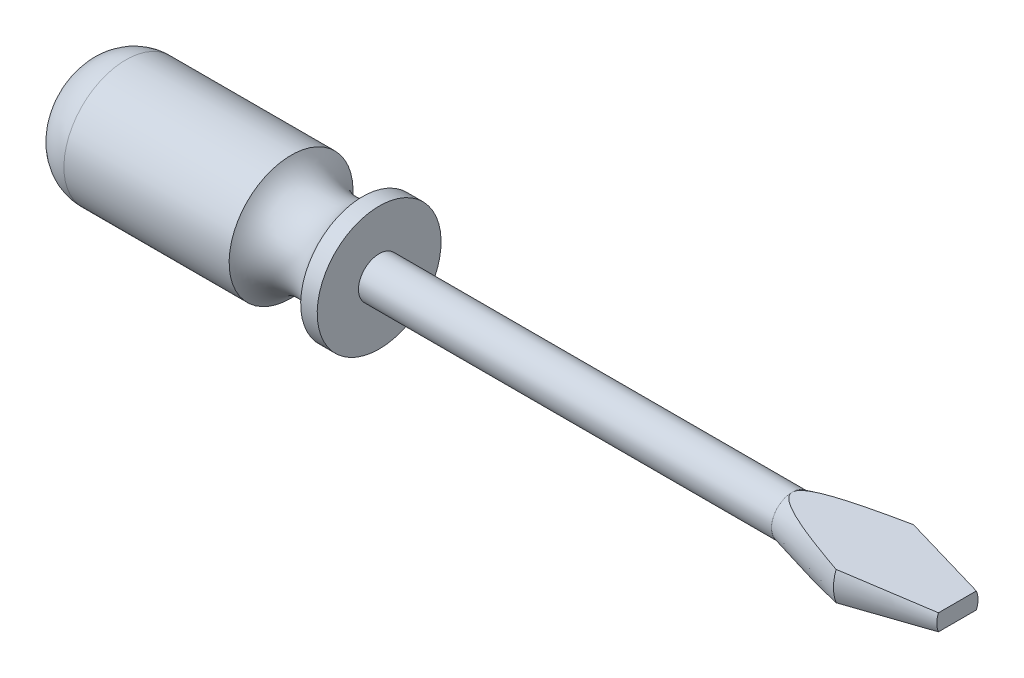
ISO-10303-21;
HEADER;
FILE_DESCRIPTION(('STEP AP214'),'2;1');
FILE_NAME('part.step','',(''),(''),'','','');
FILE_SCHEMA(('AUTOMOTIVE_DESIGN { 1 0 10303 214 1 1 1 1 }'));
ENDSEC;
DATA;
#1=APPLICATION_CONTEXT('core data for automotive mechanical design processes');
#2=APPLICATION_PROTOCOL_DEFINITION('international standard','automotive_design',2000,#1);
#3=PRODUCT_CONTEXT('',#1,'mechanical');
#4=PRODUCT('Part','Part','',(#3));
#5=PRODUCT_RELATED_PRODUCT_CATEGORY('part','',(#4));
#6=PRODUCT_DEFINITION_FORMATION('','',#4);
#7=PRODUCT_DEFINITION_CONTEXT('part definition',#1,'design');
#8=PRODUCT_DEFINITION('design','',#6,#7);
#9=PRODUCT_DEFINITION_SHAPE('','',#8);
#10=(LENGTH_UNIT() NAMED_UNIT(*) SI_UNIT(.MILLI.,.METRE.));
#11=(NAMED_UNIT(*) PLANE_ANGLE_UNIT() SI_UNIT($,.RADIAN.));
#12=(NAMED_UNIT(*) SI_UNIT($,.STERADIAN.) SOLID_ANGLE_UNIT());
#13=UNCERTAINTY_MEASURE_WITH_UNIT(LENGTH_MEASURE(1.E-05),#10,'distance_accuracy_value','');
#14=(GEOMETRIC_REPRESENTATION_CONTEXT(3) GLOBAL_UNCERTAINTY_ASSIGNED_CONTEXT((#13)) GLOBAL_UNIT_ASSIGNED_CONTEXT((#10,
#11,#12)) REPRESENTATION_CONTEXT('',''));
#15=CARTESIAN_POINT('',(0.,0.,0.));
#16=DIRECTION('',(0.,0.,1.));
#17=DIRECTION('',(1.,0.,0.));
#18=AXIS2_PLACEMENT_3D('',#15,#16,#17);
#19=CARTESIAN_POINT('',(262.604902341225,-10.16,0.));
#20=DIRECTION('',(-1.,0.,0.));
#21=DIRECTION('',(0.,-1.,0.));
#22=AXIS2_PLACEMENT_3D('',#19,#20,#21);
#23=CONICAL_SURFACE('',#22,6.34999999999998,0.244978663126864);
#24=CARTESIAN_POINT('',(262.604902341225,-10.16,0.));
#25=DIRECTION('',(-1.,0.,0.));
#26=DIRECTION('',(0.,-1.,0.));
#27=AXIS2_PLACEMENT_3D('',#24,#25,#26);
#28=CIRCLE('',#27,6.34999999999998);
#29=CARTESIAN_POINT('',(262.604902341225,-7.61999999999998,-5.81987113259389));
#30=VERTEX_POINT('',#29);
#31=CARTESIAN_POINT('',(262.604902341225,-12.7,-5.81987113259389));
#32=VERTEX_POINT('',#31);
#33=EDGE_CURVE('E134',#30,#32,#28,.T.);
#34=ORIENTED_EDGE('',*,*,#33,.T.);
#35=CARTESIAN_POINT('',(262.605102341225,-12.699985,-5.81982312465548));
#36=CARTESIAN_POINT('',(260.953041574203,-12.8238895575267,-6.21634585834817));
#37=CARTESIAN_POINT('',(259.300881256028,-12.9478015813898,-6.61245102144552));
#38=CARTESIAN_POINT('',(255.996421578026,-13.1956360572399,-7.40407731520765));
#39=CARTESIAN_POINT('',(254.344122218208,-13.3195585092263,-7.79959844590715));
#40=CARTESIAN_POINT('',(250.110744727801,-13.6370618210068,-8.81251753072126));
#41=CARTESIAN_POINT('',(247.529609589218,-13.8306469564005,-9.42967581288631));
#42=CARTESIAN_POINT('',(242.367223432261,-14.2178259181723,-10.6635058675909));
#43=CARTESIAN_POINT('',(239.785972413875,-14.4114197445512,-11.2801776400872));
#44=CARTESIAN_POINT('',(237.204702341225,-14.605015,-11.8967689585145));
#45=B_SPLINE_CURVE_WITH_KNOTS('',3,(#35,#36,#37,#38,#39,#40,#41,#42,#43,#44),.UNSPECIFIED.,.F.,
.F.,(4,2,2,2,4),(0.,5.11047790606675,10.2209555082263,18.2037847393658,26.1866146780629),.UNSPECIFIED.);
#46=CARTESIAN_POINT('',(237.204902341225,-14.605,-11.8967211869489));
#47=VERTEX_POINT('',#46);
#48=EDGE_CURVE('E169',#32,#47,#45,.T.);
#49=ORIENTED_EDGE('',*,*,#48,.T.);
#50=CARTESIAN_POINT('',(237.204902341225,-10.16,0.));
#51=DIRECTION('',(-1.,0.,0.));
#52=DIRECTION('',(0.,-1.,0.));
#53=AXIS2_PLACEMENT_3D('',#50,#51,#52);
#54=CIRCLE('',#53,12.7);
#55=CARTESIAN_POINT('',(237.204902341225,-5.71499999999999,-11.8967211869489));
#56=VERTEX_POINT('',#55);
#57=EDGE_CURVE('E175',#56,#47,#54,.T.);
#58=ORIENTED_EDGE('',*,*,#57,.F.);
#59=CARTESIAN_POINT('',(237.204702341225,-5.71498499999999,-11.8967689585145));
#60=CARTESIAN_POINT('',(238.857212934661,-5.83892329450762,-11.5020494331461));
#61=CARTESIAN_POINT('',(240.509711628732,-5.96286069656299,-11.1072797827059));
#62=CARTESIAN_POINT('',(243.814670851591,-6.21073263827738,-10.317579580244));
#63=CARTESIAN_POINT('',(245.467131380376,-6.3346671779363,-9.92264902821614));
#64=CARTESIAN_POINT('',(248.771999517479,-6.58253228821903,-9.13256646401271));
#65=CARTESIAN_POINT('',(250.424407125805,-6.70646285884348,-8.73741445187217));
#66=CARTESIAN_POINT('',(253.729143940903,-6.95431811997584,-7.94678094404611));
#67=CARTESIAN_POINT('',(255.381473147677,-7.07824281048384,-7.55129944836611));
#68=CARTESIAN_POINT('',(257.962349986188,-7.27180857337218,-6.93314213404777));
#69=CARTESIAN_POINT('',(258.89094004132,-7.34145282750705,-6.71064445273438));
#70=CARTESIAN_POINT('',(260.748065784407,-7.48073725823858,-6.26542087527748));
#71=CARTESIAN_POINT('',(261.67660147236,-7.55037743483507,-6.04269497912436));
#72=CARTESIAN_POINT('',(262.605102341225,-7.62001499999998,-5.81982312465549));
#73=B_SPLINE_CURVE_WITH_KNOTS('',3,(#59,#60,#61,#62,#63,#64,#65,#66,#67,#68,#69,#70,#71,#72),
.UNSPECIFIED.,.F.,.F.,(4,2,2,2,2,2,4),(0.,5.11053806241534,10.221076321393,15.3316137716052,
20.442151136199,23.3143828701998,26.1866147250381),.UNSPECIFIED.);
#74=EDGE_CURVE('E60',#56,#30,#73,.T.);
#75=ORIENTED_EDGE('',*,*,#74,.T.);
#76=EDGE_LOOP('',(#34,#49,#58,#75));
#77=FACE_BOUND('',#76,.T.);
#78=ADVANCED_FACE('F38',(#77),#23,.T.);
#79=CARTESIAN_POINT('',(237.204902341225,-10.16,0.));
#80=DIRECTION('',(1.,0.,0.));
#81=DIRECTION('',(0.,1.,0.));
#82=AXIS2_PLACEMENT_3D('',#79,#80,#81);
#83=CONICAL_SURFACE('',#82,12.7,0.244978663126864);
#84=ORIENTED_EDGE('',*,*,#57,.T.);
#85=CARTESIAN_POINT('',(237.205102341225,-14.604985,-11.896780167435));
#86=CARTESIAN_POINT('',(236.423148954335,-14.6636315040167,-11.666133264435));
#87=CARTESIAN_POINT('',(235.641791040913,-14.7222333475234,-11.4334322132479));
#88=CARTESIAN_POINT('',(234.080539261981,-14.8393272309433,-10.9629047530639));
#89=CARTESIAN_POINT('',(233.300645528121,-14.8978192609828,-10.7250779051218));
#90=CARTESIAN_POINT('',(231.73977346084,-15.0148846660289,-10.2424069184595));
#91=CARTESIAN_POINT('',(230.958802244536,-15.0734575072517,-9.99753957309691));
#92=CARTESIAN_POINT('',(229.399302809387,-15.1904199648879,-9.50023868483601));
#93=CARTESIAN_POINT('',(228.620774460083,-15.2488095910856,-9.24780555384782));
#94=CARTESIAN_POINT('',(227.002511802881,-15.3701792903758,-8.71216708799808));
#95=CARTESIAN_POINT('',(226.163044870306,-15.4331393103189,-8.42814409154545));
#96=CARTESIAN_POINT('',(224.907588253603,-15.5272985565717,-7.99104744771596));
#97=CARTESIAN_POINT('',(224.489687740695,-15.5586410950397,-7.843490546611));
#98=CARTESIAN_POINT('',(223.655427652557,-15.6212106016501,-7.5440591647481));
#99=CARTESIAN_POINT('',(223.239068066127,-15.6524375706324,-7.39218471544113));
#100=CARTESIAN_POINT('',(222.409020474117,-15.7146911400331,-7.08363726494979));
#101=CARTESIAN_POINT('',(221.995328886915,-15.7457180090732,-6.92697397223866));
#102=CARTESIAN_POINT('',(221.170286560956,-15.8075961835202,-6.60757105286901));
#103=CARTESIAN_POINT('',(220.758935777071,-15.8384474923116,-6.44483154381463));
#104=CARTESIAN_POINT('',(219.939341055086,-15.8999170964604,-6.11198894514595));
#105=CARTESIAN_POINT('',(219.531096234769,-15.9305354579842,-5.94188804584711));
#106=CARTESIAN_POINT('',(218.718555396105,-15.991476020884,-5.59248136564047));
#107=CARTESIAN_POINT('',(218.314259018587,-16.0217982491979,-5.41317643144125));
#108=CARTESIAN_POINT('',(217.717597458846,-16.0665478661784,-5.13798472724237));
#109=CARTESIAN_POINT('',(217.523158407819,-16.0811307950054,-5.04661509816555));
#110=CARTESIAN_POINT('',(217.135800996474,-16.1101826008563,-4.86066957075078));
#111=CARTESIAN_POINT('',(216.94288267272,-16.1246514751378,-4.76609359561003));
#112=CARTESIAN_POINT('',(216.558677528833,-16.1534668609294,-4.57315049147633));
#113=CARTESIAN_POINT('',(216.367392679653,-16.1678132246179,-4.47477940655367));
#114=CARTESIAN_POINT('',(215.987086951308,-16.1963361542438,-4.27373391947859));
#115=CARTESIAN_POINT('',(215.798065987508,-16.2105127265287,-4.17105967884532));
#116=CARTESIAN_POINT('',(215.42464642301,-16.2385191938661,-3.96164111978326));
#117=CARTESIAN_POINT('',(215.240220874325,-16.2523511100175,-3.85494529689914));
#118=CARTESIAN_POINT('',(214.874920810834,-16.2797486147793,-3.63561365341306));
#119=CARTESIAN_POINT('',(214.694045950007,-16.2933142293414,-3.52297841559905));
#120=CARTESIAN_POINT('',(214.337214248218,-16.3200766069755,-3.29066932417492));
#121=CARTESIAN_POINT('',(214.161250376139,-16.3332738973814,-3.17100638493364));
#122=CARTESIAN_POINT('',(213.815660631936,-16.3591931281967,-2.9228561781945));
#123=CARTESIAN_POINT('',(213.64603180488,-16.3719152902259,-2.79437310620017));
#124=CARTESIAN_POINT('',(213.385901580478,-16.391425057056,-2.58324162558706));
#125=CARTESIAN_POINT('',(213.292400870262,-16.3984376103222,-2.50431161894544));
#126=CARTESIAN_POINT('',(213.109088364642,-16.4121860482438,-2.34219346010268));
#127=CARTESIAN_POINT('',(213.019277329387,-16.4189218758879,-2.25900443830693));
#128=CARTESIAN_POINT('',(212.844438175806,-16.4320348124064,-2.08782950453245));
#129=CARTESIAN_POINT('',(212.759405908953,-16.4384122324204,-1.99984788797691));
#130=CARTESIAN_POINT('',(212.595464157806,-16.4507078637564,-1.81836027114636));
#131=CARTESIAN_POINT('',(212.516552151159,-16.4566262642549,-1.72485657498288));
#132=CARTESIAN_POINT('',(212.343515555669,-16.4696040089167,-1.50170585466757));
#133=CARTESIAN_POINT('',(212.252210364966,-16.4764518982195,-1.36980901725));
#134=CARTESIAN_POINT('',(212.089348035938,-16.4886665728965,-1.0941475050801));
#135=CARTESIAN_POINT('',(212.017759799522,-16.4940356906278,-0.950401989131232));
#136=CARTESIAN_POINT('',(211.915616459397,-16.5016964411371,-0.686122892290398));
#137=CARTESIAN_POINT('',(211.87941684517,-16.5044114122041,-0.567822731114482));
#138=CARTESIAN_POINT('',(211.827288680122,-16.5083210245827,-0.326856382706482));
#139=CARTESIAN_POINT('',(211.811328353188,-16.5095180491028,-0.204197351081149));
#140=CARTESIAN_POINT('',(211.801645219382,-16.5102442841382,0.0424573223423772));
#141=CARTESIAN_POINT('',(211.807999242697,-16.5097677323896,0.166456113756943));
#142=CARTESIAN_POINT('',(211.8422535813,-16.5071986569943,0.411464838814655));
#143=CARTESIAN_POINT('',(211.870181529483,-16.5051040608807,0.532470733723015));
#144=CARTESIAN_POINT('',(211.955145024342,-16.4987317987662,0.802800188340951));
#145=CARTESIAN_POINT('',(212.018271789895,-16.4939972913498,0.950163308258109));
#146=CARTESIAN_POINT('',(212.16667845997,-16.4828667910941,1.2331005572344));
#147=CARTESIAN_POINT('',(212.252005076631,-16.4764672948446,1.3686490136259));
#148=CARTESIAN_POINT('',(212.430560293883,-16.4630756535507,1.61818866676422));
#149=CARTESIAN_POINT('',(212.522624796809,-16.4561708158312,1.73303696132612));
#150=CARTESIAN_POINT('',(212.716168362139,-16.4416550484315,1.95453996463457));
#151=CARTESIAN_POINT('',(212.817656273818,-16.4340434550555,2.06118679626261));
#152=CARTESIAN_POINT('',(213.027811343477,-16.4182818248311,2.26774720267559));
#153=CARTESIAN_POINT('',(213.136500844983,-16.4101301122181,2.36763767340383));
#154=CARTESIAN_POINT('',(213.358997269276,-16.3934428803962,2.56135921216659));
#155=CARTESIAN_POINT('',(213.472801801935,-16.3849075404467,2.655193061389));
#156=CARTESIAN_POINT('',(213.694572313226,-16.3682747520999,2.8300250718732));
#157=CARTESIAN_POINT('',(213.802215885832,-16.3602014841545,2.91143713233013));
#158=CARTESIAN_POINT('',(214.020192635562,-16.3438532279247,3.07056505842257));
#159=CARTESIAN_POINT('',(214.130526098925,-16.3355782181725,3.14828052807408));
#160=CARTESIAN_POINT('',(214.464907971201,-16.3104995777518,3.3766913687632));
#161=CARTESIAN_POINT('',(214.692230906053,-16.2934503576379,3.52256872453639));
#162=CARTESIAN_POINT('',(215.153365844264,-16.2588652372721,3.80464449381971));
#163=CARTESIAN_POINT('',(215.387190803561,-16.2413283653248,3.94082131992909));
#164=CARTESIAN_POINT('',(215.859298829066,-16.2059202634119,4.205203783907));
#165=CARTESIAN_POINT('',(216.097582445266,-16.1880489921969,4.33340842983334));
#166=CARTESIAN_POINT('',(216.579645695055,-16.1518942484627,4.58442425084875));
#167=CARTESIAN_POINT('',(216.823455406171,-16.133608520129,4.7071770386145));
#168=CARTESIAN_POINT('',(217.313753529073,-16.0968361609114,4.94719837008236));
#169=CARTESIAN_POINT('',(217.560242099497,-16.0783495181296,5.06446658678919));
#170=CARTESIAN_POINT('',(218.054981473709,-16.0412440650637,5.2942076252729));
#171=CARTESIAN_POINT('',(218.303229119173,-16.0226254916539,5.40668730576532));
#172=CARTESIAN_POINT('',(218.801451894903,-15.9852587834741,5.62770467267778));
#173=CARTESIAN_POINT('',(219.051426984618,-15.9665106517455,5.73624245125965));
#174=CARTESIAN_POINT('',(219.675099606255,-15.9197352051228,6.00203813742517));
#175=CARTESIAN_POINT('',(220.049669777516,-15.8916424422782,6.15723629159133));
#176=CARTESIAN_POINT('',(220.801288758477,-15.8352710187061,6.46148943280876));
#177=CARTESIAN_POINT('',(221.178337662001,-15.8069923509418,6.61054418575221));
#178=CARTESIAN_POINT('',(221.934459137276,-15.7502832402962,6.90354313354041));
#179=CARTESIAN_POINT('',(222.313531972565,-15.7218527776495,7.0474866432035));
#180=CARTESIAN_POINT('',(223.073293257692,-15.664870681265,7.33102601838842));
#181=CARTESIAN_POINT('',(223.453981730613,-15.6363190457959,7.47062182155514));
#182=CARTESIAN_POINT('',(224.599062999327,-15.5504379506424,7.88421755719093));
#183=CARTESIAN_POINT('',(225.365460491359,-15.4929581387399,8.15263821740255));
#184=CARTESIAN_POINT('',(226.901992610424,-15.3777182298101,8.67822915369851));
#185=CARTESIAN_POINT('',(227.672126951868,-15.3199581542018,8.93540027493936));
#186=CARTESIAN_POINT('',(229.170850184902,-15.2075539117242,9.42638556616627));
#187=CARTESIAN_POINT('',(229.899279031903,-15.1529217481991,9.66069213774161));
#188=CARTESIAN_POINT('',(231.358154542361,-15.0435060849148,10.1229529842761));
#189=CARTESIAN_POINT('',(232.088601256751,-14.9887225813355,10.3509070972463));
#190=CARTESIAN_POINT('',(233.549328630996,-14.8791680282672,10.8010215769278));
#191=CARTESIAN_POINT('',(234.279605408216,-14.8243972699757,11.0231946388345));
#192=CARTESIAN_POINT('',(235.74144716165,-14.7147591384681,11.4631084132408));
#193=CARTESIAN_POINT('',(236.473012072962,-14.6598917701197,11.6808493424824));
#194=CARTESIAN_POINT('',(237.205102341225,-14.604985,11.896780167435));
#195=B_SPLINE_CURVE_WITH_KNOTS('',3,(#85,#86,#87,#88,#89,#90,#91,#92,#93,#94,#95,#96,#97,#98,
#99,#100,#101,#102,#103,#104,#105,#106,#107,#108,#109,#110,#111,#112,#113,#114,#115,#116,#117,
#118,#119,#120,#121,#122,#123,#124,#125,#126,#127,#128,#129,#130,#131,#132,#133,#134,#135,#136,
#137,#138,#139,#140,#141,#142,#143,#144,#145,#146,#147,#148,#149,#150,#151,#152,#153,#154,#155,
#156,#157,#158,#159,#160,#161,#162,#163,#164,#165,#166,#167,#168,#169,#170,#171,#172,#173,#174,
#175,#176,#177,#178,#179,#180,#181,#182,#183,#184,#185,#186,#187,#188,#189,#190,#191,#192,#193,
#194),.UNSPECIFIED.,.F.,.F.,(4,2,2,2,2,2,2,2,2,2,2,2,2,2,2,2,2,2,2,2,2,2,2,2,2,2,2,2,2,2,2,2,2,
2,2,2,2,2,2,2,2,2,2,2,2,2,2,2,2,2,2,2,2,2,4),(0.,2.45210756189365,4.90442594987017,
7.36605145643176,9.82754318532405,12.4927650821045,13.8256255492284,15.1584763096837,
16.4887840050669,17.8190659659045,19.1489547986512,20.4787215091637,21.1246926501334,
21.7706792752395,22.4173584876576,23.0640134486427,23.7044647675775,24.3448533605901,
24.9842724293535,25.6233894231932,25.990973702221,26.3586333353133,26.7259687036676,
27.0931518680609,27.5736356757967,28.0533572547286,28.4231012079995,28.7922639337393,
29.1626989621424,29.5336092494143,30.012047778047,30.491501278452,30.9329141055299,
31.3747457270137,31.8180189233256,32.2610870997415,32.6666113323136,33.0721789078272,
33.8837192250454,34.6970124913964,35.5104067504823,36.3310646162872,37.151771348277,
37.9712600399993,38.7907295596923,40.0099218881612,41.229160633764,42.4485622106311,
43.6679812681993,46.1100754053703,48.5519857564292,50.8533486986866,53.154770272534,
55.4506178328488,57.746352849555),.UNSPECIFIED.);
#196=CARTESIAN_POINT('',(211.804902341225,-16.51,0.));
#197=VERTEX_POINT('',#196);
#198=EDGE_CURVE('E11',#47,#197,#195,.T.);
#199=ORIENTED_EDGE('',*,*,#198,.T.);
#200=CARTESIAN_POINT('',(211.804902341225,-10.16,0.));
#201=DIRECTION('',(-1.,0.,0.));
#202=DIRECTION('',(0.,-1.,0.));
#203=AXIS2_PLACEMENT_3D('',#200,#201,#202);
#204=CIRCLE('',#203,6.34999999999998);
#205=CARTESIAN_POINT('',(211.804902341225,-3.81,0.));
#206=VERTEX_POINT('',#205);
#207=EDGE_CURVE('E111',#206,#197,#204,.T.);
#208=ORIENTED_EDGE('',*,*,#207,.F.);
#209=CARTESIAN_POINT('',(237.205102341225,-5.71501499999999,11.896780167435));
#210=CARTESIAN_POINT('',(236.423148954335,-5.65636849598325,11.666133264435));
#211=CARTESIAN_POINT('',(235.641791040913,-5.59776665247658,11.4334322132479));
#212=CARTESIAN_POINT('',(234.080539261981,-5.48067276905664,10.9629047530639));
#213=CARTESIAN_POINT('',(233.300645528121,-5.42218073901718,10.7250779051218));
#214=CARTESIAN_POINT('',(231.73977346084,-5.30511533397106,10.2424069184595));
#215=CARTESIAN_POINT('',(230.958802244536,-5.24654249274826,9.9975395730969));
#216=CARTESIAN_POINT('',(229.399302809387,-5.12958003511209,9.500238684836));
#217=CARTESIAN_POINT('',(228.620774460083,-5.07119040891431,9.24780555384781));
#218=CARTESIAN_POINT('',(227.002511802881,-4.94982070962413,8.71216708799806));
#219=CARTESIAN_POINT('',(226.163044870306,-4.88686068968106,8.42814409154543));
#220=CARTESIAN_POINT('',(224.907588253603,-4.7927014434283,7.99104744771594));
#221=CARTESIAN_POINT('',(224.489687740695,-4.76135890496023,7.84349054661098));
#222=CARTESIAN_POINT('',(223.655427652557,-4.69878939834987,7.54405916474808));
#223=CARTESIAN_POINT('',(223.239068066127,-4.6675624293676,7.39218471544111));
#224=CARTESIAN_POINT('',(222.409020474117,-4.60530885996687,7.08363726494977));
#225=CARTESIAN_POINT('',(221.995328886915,-4.57428199092673,6.92697397223864));
#226=CARTESIAN_POINT('',(221.170286560956,-4.5124038164798,6.607571052869));
#227=CARTESIAN_POINT('',(220.758935777071,-4.48155250768838,6.44483154381463));
#228=CARTESIAN_POINT('',(219.939341055086,-4.42008290353953,6.11198894514594));
#229=CARTESIAN_POINT('',(219.531096234769,-4.38946454201577,5.94188804584709));
#230=CARTESIAN_POINT('',(218.718555396105,-4.32852397911599,5.59248136564046));
#231=CARTESIAN_POINT('',(218.314259018587,-4.2982017508021,5.41317643144125));
#232=CARTESIAN_POINT('',(217.717597458846,-4.25345213382157,5.13798472724237));
#233=CARTESIAN_POINT('',(217.523158407819,-4.23886920499451,5.04661509816554));
#234=CARTESIAN_POINT('',(217.135800996474,-4.20981739914367,4.86066957075078));
#235=CARTESIAN_POINT('',(216.94288267272,-4.19534852486212,4.76609359561003));
#236=CARTESIAN_POINT('',(216.558677528833,-4.16653313907055,4.57315049147634));
#237=CARTESIAN_POINT('',(216.367392679653,-4.15218677538209,4.47477940655367));
#238=CARTESIAN_POINT('',(215.987086951308,-4.12366384575617,4.27373391947858));
#239=CARTESIAN_POINT('',(215.798065987508,-4.10948727347122,4.17105967884532));
#240=CARTESIAN_POINT('',(215.42464642301,-4.08148080613382,3.96164111978326));
#241=CARTESIAN_POINT('',(215.240220874325,-4.0676488899825,3.85494529689913));
#242=CARTESIAN_POINT('',(214.874920810834,-4.04025138522063,3.63561365341306));
#243=CARTESIAN_POINT('',(214.694045950007,-4.02668577065859,3.52297841559905));
#244=CARTESIAN_POINT('',(214.337214248218,-3.99992339302444,3.29066932417491));
#245=CARTESIAN_POINT('',(214.161250376139,-3.98672610261854,3.17100638493364));
#246=CARTESIAN_POINT('',(213.815660631936,-3.96080687180329,2.92285617819449));
#247=CARTESIAN_POINT('',(213.64603180488,-3.94808470977407,2.79437310620016));
#248=CARTESIAN_POINT('',(213.385901580478,-3.92857494294391,2.58324162558707));
#249=CARTESIAN_POINT('',(213.292400870262,-3.92156238967773,2.50431161894546));
#250=CARTESIAN_POINT('',(213.109088364642,-3.90781395175621,2.3421934601027));
#251=CARTESIAN_POINT('',(213.019277329387,-3.9010781241121,2.25900443830695));
#252=CARTESIAN_POINT('',(212.844438175806,-3.88796518759355,2.08782950453247));
#253=CARTESIAN_POINT('',(212.759405908953,-3.88158776757956,1.99984788797693));
#254=CARTESIAN_POINT('',(212.595464157806,-3.86929213624351,1.81836027114638));
#255=CARTESIAN_POINT('',(212.516552151159,-3.86337373574504,1.7248565749829));
#256=CARTESIAN_POINT('',(212.343515555669,-3.85039599108325,1.50170585466759));
#257=CARTESIAN_POINT('',(212.252210364966,-3.84354810178051,1.36980901725002));
#258=CARTESIAN_POINT('',(212.089348035938,-3.83133342710344,1.09414750508012));
#259=CARTESIAN_POINT('',(212.017759799522,-3.82596430937221,0.950401989131251));
#260=CARTESIAN_POINT('',(211.915616459397,-3.81830355886284,0.686122892290419));
#261=CARTESIAN_POINT('',(211.87941684517,-3.81558858779587,0.567822731114505));
#262=CARTESIAN_POINT('',(211.827288680122,-3.81167897541726,0.326856382706503));
#263=CARTESIAN_POINT('',(211.811328353188,-3.81048195089719,0.204197351081168));
#264=CARTESIAN_POINT('',(211.801645219382,-3.80975571586176,-0.042457322342364));
#265=CARTESIAN_POINT('',(211.807999242697,-3.81023226761038,-0.166456113756932));
#266=CARTESIAN_POINT('',(211.8422535813,-3.81280134300561,-0.41146483881465));
#267=CARTESIAN_POINT('',(211.870181529483,-3.81489593911931,-0.532470733723014));
#268=CARTESIAN_POINT('',(211.955145024342,-3.82126820123372,-0.802800188340957));
#269=CARTESIAN_POINT('',(212.018271789895,-3.8260027086502,-0.950163308258117));
#270=CARTESIAN_POINT('',(212.16667845997,-3.83713320890583,-1.23310055723441));
#271=CARTESIAN_POINT('',(212.252005076631,-3.84353270515538,-1.36864901362591));
#272=CARTESIAN_POINT('',(212.430560293883,-3.85692434644928,-1.61818866676423));
#273=CARTESIAN_POINT('',(212.522624796809,-3.8638291841688,-1.73303696132612));
#274=CARTESIAN_POINT('',(212.716168362139,-3.87834495156849,-1.95453996463456));
#275=CARTESIAN_POINT('',(212.817656273818,-3.88595654494445,-2.0611867962626));
#276=CARTESIAN_POINT('',(213.027811343477,-3.9017181751689,-2.26774720267559));
#277=CARTESIAN_POINT('',(213.136500844983,-3.90986988778183,-2.36763767340383));
#278=CARTESIAN_POINT('',(213.358997269276,-3.92655711960379,-2.56135921216659));
#279=CARTESIAN_POINT('',(213.472801801935,-3.93509245955323,-2.655193061389));
#280=CARTESIAN_POINT('',(213.694572313226,-3.95172524790006,-2.83002507187321));
#281=CARTESIAN_POINT('',(213.802215885832,-3.9597985158455,-2.91143713233015));
#282=CARTESIAN_POINT('',(214.020192635562,-3.97614677207525,-3.07056505842259));
#283=CARTESIAN_POINT('',(214.130526098925,-3.98442178182746,-3.1482805280741));
#284=CARTESIAN_POINT('',(214.464907971201,-4.00950042224814,-3.37669136876322));
#285=CARTESIAN_POINT('',(214.692230906053,-4.0265496423621,-3.52256872453639));
#286=CARTESIAN_POINT('',(215.153365844264,-4.06113476272787,-3.80464449381971));
#287=CARTESIAN_POINT('',(215.387190803561,-4.07867163467515,-3.9408213199291));
#288=CARTESIAN_POINT('',(215.859298829066,-4.11407973658807,-4.20520378390702));
#289=CARTESIAN_POINT('',(216.097582445266,-4.13195100780303,-4.33340842983337));
#290=CARTESIAN_POINT('',(216.579645695055,-4.16810575153725,-4.58442425084878));
#291=CARTESIAN_POINT('',(216.823455406172,-4.18639147987095,-4.70717703861452));
#292=CARTESIAN_POINT('',(217.313753529073,-4.22316383908854,-4.94719837008239));
#293=CARTESIAN_POINT('',(217.560242099497,-4.24165048187035,-5.06446658678921));
#294=CARTESIAN_POINT('',(218.054981473709,-4.27875593493627,-5.29420762527293));
#295=CARTESIAN_POINT('',(218.303229119173,-4.29737450834607,-5.40668730576535));
#296=CARTESIAN_POINT('',(218.801451894903,-4.33474121652582,-5.62770467267781));
#297=CARTESIAN_POINT('',(219.051426984618,-4.35348934825447,-5.73624245125968));
#298=CARTESIAN_POINT('',(219.675099606255,-4.40026479487719,-6.00203813742519));
#299=CARTESIAN_POINT('',(220.049669777516,-4.42835755772178,-6.15723629159135));
#300=CARTESIAN_POINT('',(220.801288758477,-4.48472898129389,-6.46148943280879));
#301=CARTESIAN_POINT('',(221.178337662002,-4.51300764905821,-6.61054418575224));
#302=CARTESIAN_POINT('',(221.934459137276,-4.56971675970377,-6.90354313354044));
#303=CARTESIAN_POINT('',(222.313531972565,-4.59814722235045,-7.04748664320352));
#304=CARTESIAN_POINT('',(223.073293257692,-4.65512931873501,-7.33102601838844));
#305=CARTESIAN_POINT('',(223.453981730613,-4.6836809542041,-7.47062182155515));
#306=CARTESIAN_POINT('',(224.599062999327,-4.76956204935758,-7.88421755719093));
#307=CARTESIAN_POINT('',(225.365460491359,-4.82704186126002,-8.15263821740254));
#308=CARTESIAN_POINT('',(226.901992610424,-4.94228177018988,-8.6782291536985));
#309=CARTESIAN_POINT('',(227.672126951868,-5.00004184579819,-8.93540027493936));
#310=CARTESIAN_POINT('',(229.170850184902,-5.11244608827574,-9.42638556616626));
#311=CARTESIAN_POINT('',(229.899279031903,-5.16707825180084,-9.6606921377416));
#312=CARTESIAN_POINT('',(231.358154542361,-5.27649391508513,-10.122952984276));
#313=CARTESIAN_POINT('',(232.088601256751,-5.33127741866443,-10.3509070972462));
#314=CARTESIAN_POINT('',(233.549328630996,-5.4408319717328,-10.8010215769278));
#315=CARTESIAN_POINT('',(234.279605408216,-5.49560273002427,-11.0231946388345));
#316=CARTESIAN_POINT('',(235.74144716165,-5.60524086153186,-11.4631084132408));
#317=CARTESIAN_POINT('',(236.473012072962,-5.66010822988024,-11.6808493424824));
#318=CARTESIAN_POINT('',(237.205102341225,-5.71501499999999,-11.896780167435));
#319=B_SPLINE_CURVE_WITH_KNOTS('',3,(#209,#210,#211,#212,#213,#214,#215,#216,#217,#218,#219,
#220,#221,#222,#223,#224,#225,#226,#227,#228,#229,#230,#231,#232,#233,#234,#235,#236,#237,#238,
#239,#240,#241,#242,#243,#244,#245,#246,#247,#248,#249,#250,#251,#252,#253,#254,#255,#256,#257,
#258,#259,#260,#261,#262,#263,#264,#265,#266,#267,#268,#269,#270,#271,#272,#273,#274,#275,#276,
#277,#278,#279,#280,#281,#282,#283,#284,#285,#286,#287,#288,#289,#290,#291,#292,#293,#294,#295,
#296,#297,#298,#299,#300,#301,#302,#303,#304,#305,#306,#307,#308,#309,#310,#311,#312,#313,#314,
#315,#316,#317,#318),.UNSPECIFIED.,.F.,.F.,(4,2,2,2,2,2,2,2,2,2,2,2,2,2,2,2,2,2,2,2,2,2,2,2,2,2,
2,2,2,2,2,2,2,2,2,2,2,2,2,2,2,2,2,2,2,2,2,2,2,2,2,2,2,2,4),(0.,2.45210756189365,4.9044259498702,
7.36605145643181,9.82754318532411,12.4927650821046,13.8256255492285,15.1584763096837,
16.488784005067,17.8190659659045,19.1489547986513,20.4787215091637,21.1246926501333,
21.7706792752396,22.4173584876576,23.0640134486427,23.7044647675775,24.3448533605901,
24.9842724293535,25.6233894231932,25.990973702221,26.3586333353132,26.7259687036676,
27.0931518680609,27.5736356757967,28.0533572547286,28.4231012079994,28.7922639337393,
29.1626989621424,29.5336092494143,30.012047778047,30.491501278452,30.9329141055299,
31.3747457270137,31.8180189233256,32.2610870997416,32.6666113323137,33.0721789078272,
33.8837192250454,34.6970124913964,35.5104067504824,36.3310646162873,37.1517713482771,
37.9712600399994,38.7907295596924,40.0099218881613,41.2291606337641,42.4485622106312,
43.6679812681993,46.1100754053703,48.5519857564291,50.8533486986866,53.154770272534,
55.4506178328488,57.746352849555),.UNSPECIFIED.);
#320=EDGE_CURVE('E92',#206,#56,#319,.T.);
#321=ORIENTED_EDGE('',*,*,#320,.T.);
#322=EDGE_LOOP('',(#84,#199,#208,#321));
#323=FACE_BOUND('',#322,.T.);
#324=ADVANCED_FACE('F112',(#323),#83,.T.);
#325=CARTESIAN_POINT('',(237.204902341225,-14.605,11.8967211869489));
#326=VERTEX_POINT('',#325);
#327=CARTESIAN_POINT('',(237.204902341225,-5.71499999999999,11.8967211869489));
#328=VERTEX_POINT('',#327);
#329=EDGE_CURVE('E109',#326,#328,#54,.T.);
#330=ORIENTED_EDGE('',*,*,#329,.F.);
#331=CARTESIAN_POINT('',(237.204702341225,-14.605015,11.8967689585145));
#332=CARTESIAN_POINT('',(238.857212934661,-14.4810767054923,11.5020494331461));
#333=CARTESIAN_POINT('',(240.509711628732,-14.357139303437,11.1072797827059));
#334=CARTESIAN_POINT('',(243.814670851591,-14.1092673617226,10.317579580244));
#335=CARTESIAN_POINT('',(245.467131380376,-13.9853328220637,9.92264902821613));
#336=CARTESIAN_POINT('',(248.771999517479,-13.7374677117809,9.1325664640127));
#337=CARTESIAN_POINT('',(250.424407125805,-13.6135371411565,8.73741445187217));
#338=CARTESIAN_POINT('',(253.729143940903,-13.3656818800241,7.94678094404611));
#339=CARTESIAN_POINT('',(255.381473147677,-13.2417571895161,7.5512994483661));
#340=CARTESIAN_POINT('',(257.962349986188,-13.0481914266278,6.93314213404776));
#341=CARTESIAN_POINT('',(258.89094004132,-12.9785471724929,6.71064445273438));
#342=CARTESIAN_POINT('',(260.748065784407,-12.8392627417614,6.26542087527748));
#343=CARTESIAN_POINT('',(261.67660147236,-12.7696225651649,6.04269497912435));
#344=CARTESIAN_POINT('',(262.605102341225,-12.699985,5.81982312465549));
#345=B_SPLINE_CURVE_WITH_KNOTS('',3,(#331,#332,#333,#334,#335,#336,#337,#338,#339,#340,#341,
#342,#343,#344),.UNSPECIFIED.,.F.,.F.,(4,2,2,2,2,2,4),(0.,5.11053806241534,10.221076321393,
15.3316137716052,20.442151136199,23.3143828701998,26.1866147250381),.UNSPECIFIED.);
#346=CARTESIAN_POINT('',(262.604902341225,-12.7,5.81987113259389));
#347=VERTEX_POINT('',#346);
#348=EDGE_CURVE('E68',#326,#347,#345,.T.);
#349=ORIENTED_EDGE('',*,*,#348,.T.);
#350=CARTESIAN_POINT('',(262.604902341225,-7.61999999999998,5.81987113259389));
#351=VERTEX_POINT('',#350);
#352=EDGE_CURVE('E101',#347,#351,#28,.T.);
#353=ORIENTED_EDGE('',*,*,#352,.T.);
#354=CARTESIAN_POINT('',(262.605102341225,-7.62001499999998,5.81982312465548));
#355=CARTESIAN_POINT('',(260.953041574203,-7.49611044247328,6.21634585834817));
#356=CARTESIAN_POINT('',(259.300881256028,-7.37219841861015,6.61245102144553));
#357=CARTESIAN_POINT('',(255.996421578026,-7.12436394276004,7.40407731520765));
#358=CARTESIAN_POINT('',(254.344122218208,-7.00044149077368,7.79959844590715));
#359=CARTESIAN_POINT('',(250.110744727801,-6.68293817899317,8.81251753072126));
#360=CARTESIAN_POINT('',(247.529609589218,-6.48935304359946,9.42967581288631));
#361=CARTESIAN_POINT('',(242.367223432261,-6.10217408182762,10.6635058675909));
#362=CARTESIAN_POINT('',(239.785972413875,-5.90858025544873,11.2801776400872));
#363=CARTESIAN_POINT('',(237.204702341225,-5.71498499999999,11.8967689585145));
#364=B_SPLINE_CURVE_WITH_KNOTS('',3,(#354,#355,#356,#357,#358,#359,#360,#361,#362,#363),
.UNSPECIFIED.,.F.,.F.,(4,2,2,2,4),(0.,5.11047790606675,10.2209555082263,18.2037847393658,
26.1866146780629),.UNSPECIFIED.);
#365=EDGE_CURVE('E156',#351,#328,#364,.T.);
#366=ORIENTED_EDGE('',*,*,#365,.T.);
#367=EDGE_LOOP('',(#330,#349,#353,#366));
#368=FACE_BOUND('',#367,.T.);
#369=ADVANCED_FACE('F40',(#368),#23,.T.);
#370=CARTESIAN_POINT('',(262.604902341225,-3.81,0.));
#371=DIRECTION('',(-1.,0.,0.));
#372=DIRECTION('',(0.,-1.,0.));
#373=AXIS2_PLACEMENT_3D('',#370,#371,#372);
#374=PLANE('',#373);
#375=ORIENTED_EDGE('',*,*,#352,.F.);
#376=DIRECTION('',(0.,0.,1.));
#377=VECTOR('',#376,1.);
#378=CARTESIAN_POINT('',(262.604902341225,-12.7,-25.4));
#379=LINE('',#378,#377);
#380=EDGE_CURVE('E157',#32,#347,#379,.T.);
#381=ORIENTED_EDGE('',*,*,#380,.F.);
#382=ORIENTED_EDGE('',*,*,#33,.F.);
#383=DIRECTION('',(0.,0.,1.));
#384=VECTOR('',#383,1.);
#385=CARTESIAN_POINT('',(262.604902341225,-7.61999999999998,-25.4));
#386=LINE('',#385,#384);
#387=EDGE_CURVE('E158',#30,#351,#386,.T.);
#388=ORIENTED_EDGE('',*,*,#387,.T.);
#389=EDGE_LOOP('',(#375,#381,#382,#388));
#390=FACE_BOUND('',#389,.T.);
#391=ADVANCED_FACE('F183',(#390),#374,.F.);
#392=CARTESIAN_POINT('',(6.92785708510068,-15.8204584943786,0.));
#393=DIRECTION('',(0.,0.,-1.));
#394=DIRECTION('',(0.,-1.,0.));
#395=AXIS2_PLACEMENT_3D('',#392,#393,#394);
#396=CIRCLE('',#395,13.3895415056214);
#397=TRIMMED_CURVE('',#396,(PARAMETER_VALUE(-2.00727645955758)),
(PARAMETER_VALUE(2.00727645955758)),.T.,.PARAMETER.);
#398=CARTESIAN_POINT('',(6.92785708510068,-10.16,0.));
#399=DIRECTION('',(-1.,0.,0.));
#400=AXIS1_PLACEMENT('',#398,#399);
#401=SURFACE_OF_REVOLUTION('',#397,#400);
#402=CARTESIAN_POINT('',(-5.20635205122847,-10.16,0.));
#403=VERTEX_POINT('',#402);
#404=VERTEX_LOOP('',#403);
#405=FACE_BOUND('',#404,.T.);
#406=CARTESIAN_POINT('',(6.92785708510068,-10.16,0.));
#407=DIRECTION('',(-1.,0.,0.));
#408=DIRECTION('',(0.,-1.,0.));
#409=AXIS2_PLACEMENT_3D('',#406,#407,#408);
#410=CIRCLE('',#409,19.05);
#411=CARTESIAN_POINT('',(6.92785708510068,-29.21,0.));
#412=VERTEX_POINT('',#411);
#413=EDGE_CURVE('E131',#412,#412,#410,.T.);
#414=ORIENTED_EDGE('',*,*,#413,.T.);
#415=EDGE_LOOP('',(#414));
#416=FACE_BOUND('',#415,.T.);
#417=ADVANCED_FACE('F190',(#405,#416),#401,.T.);
#418=CARTESIAN_POINT('',(-5.20635205122847,-10.16,0.));
#419=DIRECTION('',(-1.,0.,0.));
#420=DIRECTION('',(0.,-1.,0.));
#421=AXIS2_PLACEMENT_3D('',#418,#419,#420);
#422=CYLINDRICAL_SURFACE('',#421,19.05);
#423=ORIENTED_EDGE('',*,*,#413,.F.);
#424=EDGE_LOOP('',(#423));
#425=FACE_BOUND('',#424,.T.);
#426=CARTESIAN_POINT('',(57.7278570851007,-10.16,0.));
#427=DIRECTION('',(-1.,0.,0.));
#428=DIRECTION('',(0.,-1.,0.));
#429=AXIS2_PLACEMENT_3D('',#426,#427,#428);
#430=CIRCLE('',#429,19.05);
#431=CARTESIAN_POINT('',(57.7278570851007,-29.21,0.));
#432=VERTEX_POINT('',#431);
#433=EDGE_CURVE('E128',#432,#432,#430,.T.);
#434=ORIENTED_EDGE('',*,*,#433,.T.);
#435=EDGE_LOOP('',(#434));
#436=FACE_BOUND('',#435,.T.);
#437=ADVANCED_FACE('F241',(#425,#436),#422,.T.);
#438=CARTESIAN_POINT('',(68.726379713163,-10.16,0.));
#439=DIRECTION('',(-1.,0.,0.));
#440=DIRECTION('',(0.,-1.,0.));
#441=AXIS2_PLACEMENT_3D('',#438,#439,#440);
#442=TOROIDAL_SURFACE('',#441,25.4,12.7);
#443=ORIENTED_EDGE('',*,*,#433,.F.);
#444=EDGE_LOOP('',(#443));
#445=FACE_BOUND('',#444,.T.);
#446=CARTESIAN_POINT('',(79.7249023412254,-10.16,0.));
#447=DIRECTION('',(-1.,0.,0.));
#448=DIRECTION('',(0.,-1.,0.));
#449=AXIS2_PLACEMENT_3D('',#446,#447,#448);
#450=CIRCLE('',#449,19.05);
#451=CARTESIAN_POINT('',(79.7249023412254,-29.21,0.));
#452=VERTEX_POINT('',#451);
#453=EDGE_CURVE('E125',#452,#452,#450,.T.);
#454=ORIENTED_EDGE('',*,*,#453,.T.);
#455=EDGE_LOOP('',(#454));
#456=FACE_BOUND('',#455,.T.);
#457=ADVANCED_FACE('F232',(#445,#456),#442,.F.);
#458=CARTESIAN_POINT('',(-5.20635205122847,-10.16,0.));
#459=DIRECTION('',(-1.,0.,0.));
#460=DIRECTION('',(0.,-1.,0.));
#461=AXIS2_PLACEMENT_3D('',#458,#459,#460);
#462=CYLINDRICAL_SURFACE('',#461,19.05);
#463=ORIENTED_EDGE('',*,*,#453,.F.);
#464=EDGE_LOOP('',(#463));
#465=FACE_BOUND('',#464,.T.);
#466=CARTESIAN_POINT('',(84.8049023412254,-10.16,0.));
#467=DIRECTION('',(-1.,0.,0.));
#468=DIRECTION('',(0.,-1.,0.));
#469=AXIS2_PLACEMENT_3D('',#466,#467,#468);
#470=CIRCLE('',#469,19.05);
#471=CARTESIAN_POINT('',(84.8049023412254,-29.21,0.));
#472=VERTEX_POINT('',#471);
#473=EDGE_CURVE('E118',#472,#472,#470,.T.);
#474=ORIENTED_EDGE('',*,*,#473,.T.);
#475=EDGE_LOOP('',(#474));
#476=FACE_BOUND('',#475,.T.);
#477=ADVANCED_FACE('F224',(#465,#476),#462,.T.);
#478=CARTESIAN_POINT('',(84.8049023412254,8.89,0.));
#479=DIRECTION('',(-1.,0.,0.));
#480=DIRECTION('',(0.,-1.,0.));
#481=AXIS2_PLACEMENT_3D('',#478,#479,#480);
#482=PLANE('',#481);
#483=ORIENTED_EDGE('',*,*,#473,.F.);
#484=EDGE_LOOP('',(#483));
#485=FACE_BOUND('',#484,.T.);
#486=CARTESIAN_POINT('',(84.8049023412254,-10.16,0.));
#487=DIRECTION('',(-1.,0.,0.));
#488=DIRECTION('',(0.,-1.,0.));
#489=AXIS2_PLACEMENT_3D('',#486,#487,#488);
#490=CIRCLE('',#489,6.34999999999999);
#491=CARTESIAN_POINT('',(84.8049023412254,-16.51,0.));
#492=VERTEX_POINT('',#491);
#493=EDGE_CURVE('E116',#492,#492,#490,.T.);
#494=ORIENTED_EDGE('',*,*,#493,.T.);
#495=EDGE_LOOP('',(#494));
#496=FACE_BOUND('',#495,.T.);
#497=ADVANCED_FACE('F199',(#485,#496),#482,.F.);
#498=CARTESIAN_POINT('',(-5.20635205122847,-10.16,0.));
#499=DIRECTION('',(-1.,0.,0.));
#500=DIRECTION('',(0.,-1.,0.));
#501=AXIS2_PLACEMENT_3D('',#498,#499,#500);
#502=CYLINDRICAL_SURFACE('',#501,6.34999999999999);
#503=ORIENTED_EDGE('',*,*,#493,.F.);
#504=EDGE_LOOP('',(#503));
#505=FACE_BOUND('',#504,.T.);
#506=EDGE_CURVE('E107',#197,#206,#204,.T.);
#507=ORIENTED_EDGE('',*,*,#506,.T.);
#508=ORIENTED_EDGE('',*,*,#207,.T.);
#509=EDGE_LOOP('',(#507,#508));
#510=FACE_BOUND('',#509,.T.);
#511=ADVANCED_FACE('F115',(#505,#510),#502,.T.);
#512=ORIENTED_EDGE('',*,*,#506,.F.);
#513=EDGE_CURVE('E43',#197,#326,#195,.T.);
#514=ORIENTED_EDGE('',*,*,#513,.T.);
#515=ORIENTED_EDGE('',*,*,#329,.T.);
#516=EDGE_CURVE('E95',#328,#206,#319,.T.);
#517=ORIENTED_EDGE('',*,*,#516,.T.);
#518=EDGE_LOOP('',(#512,#514,#515,#517));
#519=FACE_BOUND('',#518,.T.);
#520=ADVANCED_FACE('F105',(#519),#83,.T.);
#521=CARTESIAN_POINT('',(211.804902341225,-3.81,-25.4));
#522=DIRECTION('',(-0.0747899482416338,-0.997199309888456,0.));
#523=DIRECTION('',(0.997199309888457,-0.0747899482416339,0.));
#524=AXIS2_PLACEMENT_3D('',#521,#522,#523);
#525=PLANE('',#524);
#526=ORIENTED_EDGE('',*,*,#387,.F.);
#527=ORIENTED_EDGE('',*,*,#74,.F.);
#528=ORIENTED_EDGE('',*,*,#320,.F.);
#529=ORIENTED_EDGE('',*,*,#516,.F.);
#530=ORIENTED_EDGE('',*,*,#365,.F.);
#531=EDGE_LOOP('',(#526,#527,#528,#529,#530));
#532=FACE_BOUND('',#531,.T.);
#533=ADVANCED_FACE('F94',(#532),#525,.F.);
#534=CARTESIAN_POINT('',(211.804902341225,-16.51,-25.4));
#535=DIRECTION('',(-0.0747899482416338,0.997199309888456,0.));
#536=DIRECTION('',(-0.997199309888457,-0.0747899482416338,0.));
#537=AXIS2_PLACEMENT_3D('',#534,#535,#536);
#538=PLANE('',#537);
#539=ORIENTED_EDGE('',*,*,#380,.T.);
#540=ORIENTED_EDGE('',*,*,#348,.F.);
#541=ORIENTED_EDGE('',*,*,#513,.F.);
#542=ORIENTED_EDGE('',*,*,#198,.F.);
#543=ORIENTED_EDGE('',*,*,#48,.F.);
#544=EDGE_LOOP('',(#539,#540,#541,#542,#543));
#545=FACE_BOUND('',#544,.T.);
#546=ADVANCED_FACE('F145',(#545),#538,.F.);
#547=CLOSED_SHELL('',(#78,#324,#369,#391,#417,#437,#457,#477,#497,#511,#520,#533,#546));
#548=MANIFOLD_SOLID_BREP('B2',#547);
#549=ADVANCED_BREP_SHAPE_REPRESENTATION('',(#18,#548),#14);
#550=SHAPE_DEFINITION_REPRESENTATION(#9,#549);
ENDSEC;
END-ISO-10303-21;
